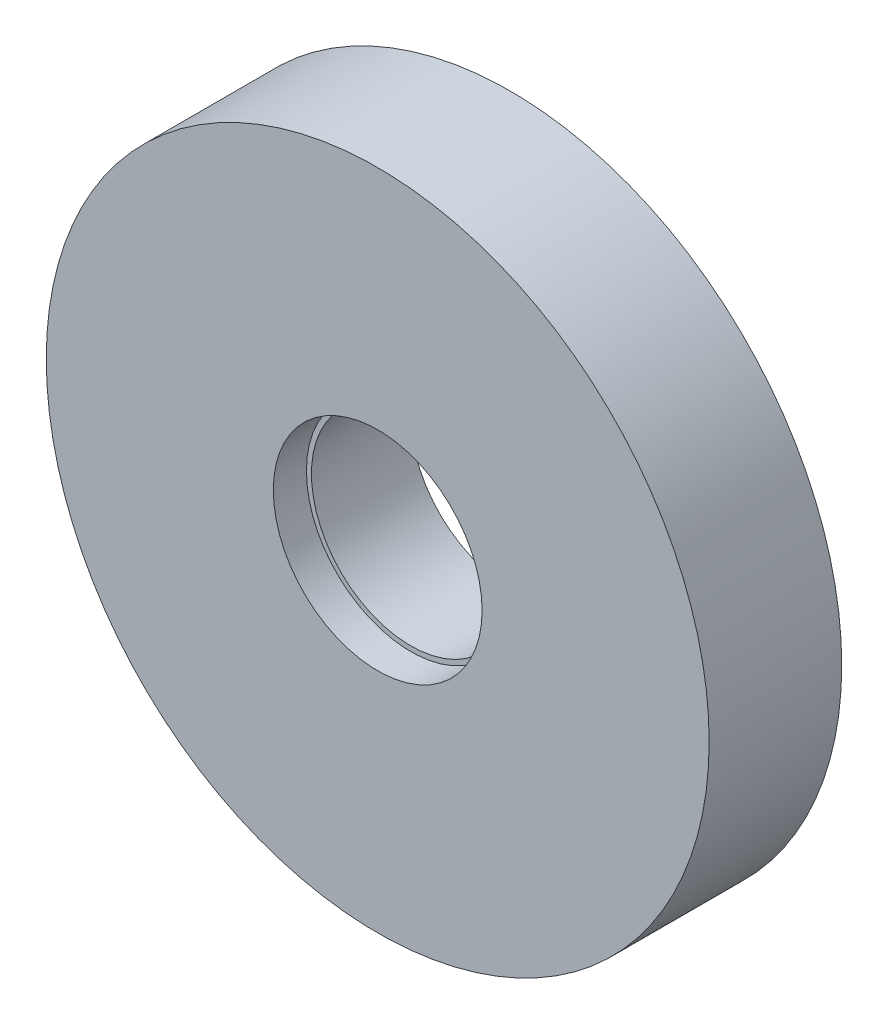
ISO-10303-21;
HEADER;
FILE_DESCRIPTION(('STEP AP214'),'2;1');
FILE_NAME('part.step','',(''),(''),'','','');
FILE_SCHEMA(('AUTOMOTIVE_DESIGN { 1 0 10303 214 1 1 1 1 }'));
ENDSEC;
DATA;
#1=APPLICATION_CONTEXT('core data for automotive mechanical design processes');
#2=APPLICATION_PROTOCOL_DEFINITION('international standard','automotive_design',2000,#1);
#3=PRODUCT_CONTEXT('',#1,'mechanical');
#4=PRODUCT('Part','Part','',(#3));
#5=PRODUCT_RELATED_PRODUCT_CATEGORY('part','',(#4));
#6=PRODUCT_DEFINITION_FORMATION('','',#4);
#7=PRODUCT_DEFINITION_CONTEXT('part definition',#1,'design');
#8=PRODUCT_DEFINITION('design','',#6,#7);
#9=PRODUCT_DEFINITION_SHAPE('','',#8);
#10=(LENGTH_UNIT() NAMED_UNIT(*) SI_UNIT(.MILLI.,.METRE.));
#11=(NAMED_UNIT(*) PLANE_ANGLE_UNIT() SI_UNIT($,.RADIAN.));
#12=(NAMED_UNIT(*) SI_UNIT($,.STERADIAN.) SOLID_ANGLE_UNIT());
#13=UNCERTAINTY_MEASURE_WITH_UNIT(LENGTH_MEASURE(1.E-05),#10,'distance_accuracy_value','');
#14=(GEOMETRIC_REPRESENTATION_CONTEXT(3) GLOBAL_UNCERTAINTY_ASSIGNED_CONTEXT((#13)) GLOBAL_UNIT_ASSIGNED_CONTEXT((#10,
#11,#12)) REPRESENTATION_CONTEXT('',''));
#15=CARTESIAN_POINT('',(0.,0.,0.));
#16=DIRECTION('',(0.,0.,1.));
#17=DIRECTION('',(1.,0.,0.));
#18=AXIS2_PLACEMENT_3D('',#15,#16,#17);
#19=CARTESIAN_POINT('',(0.,0.,0.));
#20=DIRECTION('',(0.,0.,1.));
#21=DIRECTION('',(1.,0.,0.));
#22=AXIS2_PLACEMENT_3D('',#19,#20,#21);
#23=PLANE('',#22);
#24=CARTESIAN_POINT('',(0.,0.,0.));
#25=DIRECTION('',(0.,0.,-1.));
#26=DIRECTION('',(-1.,0.,0.));
#27=AXIS2_PLACEMENT_3D('',#24,#25,#26);
#28=CIRCLE('',#27,3.);
#29=CARTESIAN_POINT('',(3.,0.,0.));
#30=VERTEX_POINT('',#29);
#31=EDGE_CURVE('E95',#30,#30,#28,.T.);
#32=ORIENTED_EDGE('',*,*,#31,.F.);
#33=EDGE_LOOP('',(#32));
#34=FACE_BOUND('',#33,.T.);
#35=CARTESIAN_POINT('',(0.,0.,0.));
#36=DIRECTION('',(0.,0.,1.));
#37=DIRECTION('',(1.,0.,0.));
#38=AXIS2_PLACEMENT_3D('',#35,#36,#37);
#39=CIRCLE('',#38,10.);
#40=CARTESIAN_POINT('',(10.,0.,0.));
#41=VERTEX_POINT('',#40);
#42=CARTESIAN_POINT('',(-10.,0.,0.));
#43=VERTEX_POINT('',#42);
#44=EDGE_CURVE('E10',#41,#43,#39,.T.);
#45=ORIENTED_EDGE('',*,*,#44,.F.);
#46=CARTESIAN_POINT('',(0.,0.,0.));
#47=DIRECTION('',(0.,0.,1.));
#48=DIRECTION('',(1.,0.,0.));
#49=AXIS2_PLACEMENT_3D('',#46,#47,#48);
#50=CIRCLE('',#49,10.);
#51=EDGE_CURVE('E25',#43,#41,#50,.T.);
#52=ORIENTED_EDGE('',*,*,#51,.F.);
#53=EDGE_LOOP('',(#45,#52));
#54=FACE_BOUND('',#53,.T.);
#55=ADVANCED_FACE('F15',(#34,#54),#23,.F.);
#56=CARTESIAN_POINT('',(0.,0.,4.));
#57=DIRECTION('',(0.,0.,1.));
#58=DIRECTION('',(1.,0.,0.));
#59=AXIS2_PLACEMENT_3D('',#56,#57,#58);
#60=PLANE('',#59);
#61=CARTESIAN_POINT('',(0.,0.,4.));
#62=DIRECTION('',(0.,0.,-1.));
#63=DIRECTION('',(1.,0.,0.));
#64=AXIS2_PLACEMENT_3D('',#61,#62,#63);
#65=CIRCLE('',#64,3.15);
#66=CARTESIAN_POINT('',(3.15,0.,4.));
#67=VERTEX_POINT('',#66);
#68=CARTESIAN_POINT('',(-3.15,0.,4.));
#69=VERTEX_POINT('',#68);
#70=EDGE_CURVE('E75',#67,#69,#65,.T.);
#71=ORIENTED_EDGE('',*,*,#70,.T.);
#72=CARTESIAN_POINT('',(0.,0.,4.));
#73=DIRECTION('',(0.,0.,-1.));
#74=DIRECTION('',(1.,0.,0.));
#75=AXIS2_PLACEMENT_3D('',#72,#73,#74);
#76=CIRCLE('',#75,3.15);
#77=EDGE_CURVE('E81',#69,#67,#76,.T.);
#78=ORIENTED_EDGE('',*,*,#77,.T.);
#79=EDGE_LOOP('',(#71,#78));
#80=FACE_BOUND('',#79,.T.);
#81=CARTESIAN_POINT('',(0.,0.,4.));
#82=DIRECTION('',(0.,0.,1.));
#83=DIRECTION('',(1.,0.,0.));
#84=AXIS2_PLACEMENT_3D('',#81,#82,#83);
#85=CIRCLE('',#84,10.);
#86=CARTESIAN_POINT('',(10.,0.,4.));
#87=VERTEX_POINT('',#86);
#88=CARTESIAN_POINT('',(-10.,0.,4.));
#89=VERTEX_POINT('',#88);
#90=EDGE_CURVE('E97',#87,#89,#85,.T.);
#91=ORIENTED_EDGE('',*,*,#90,.T.);
#92=CARTESIAN_POINT('',(0.,0.,4.));
#93=DIRECTION('',(0.,0.,1.));
#94=DIRECTION('',(1.,0.,0.));
#95=AXIS2_PLACEMENT_3D('',#92,#93,#94);
#96=CIRCLE('',#95,10.);
#97=EDGE_CURVE('E18',#89,#87,#96,.T.);
#98=ORIENTED_EDGE('',*,*,#97,.T.);
#99=EDGE_LOOP('',(#91,#98));
#100=FACE_BOUND('',#99,.T.);
#101=ADVANCED_FACE('F86',(#80,#100),#60,.T.);
#102=CARTESIAN_POINT('',(0.,0.,0.));
#103=DIRECTION('',(0.,0.,1.));
#104=DIRECTION('',(1.,0.,0.));
#105=AXIS2_PLACEMENT_3D('',#102,#103,#104);
#106=CYLINDRICAL_SURFACE('',#105,10.);
#107=ORIENTED_EDGE('',*,*,#90,.F.);
#108=ORIENTED_EDGE('',*,*,#97,.F.);
#109=DIRECTION('',(0.,0.,-1.));
#110=VECTOR('',#109,1.);
#111=CARTESIAN_POINT('',(-10.,0.,0.));
#112=LINE('',#111,#110);
#113=EDGE_CURVE('E101',#89,#43,#112,.T.);
#114=ORIENTED_EDGE('',*,*,#113,.T.);
#115=ORIENTED_EDGE('',*,*,#51,.T.);
#116=ORIENTED_EDGE('',*,*,#44,.T.);
#117=ORIENTED_EDGE('',*,*,#113,.F.);
#118=EDGE_LOOP('',(#107,#108,#114,#115,#116,#117));
#119=FACE_BOUND('',#118,.T.);
#120=ADVANCED_FACE('F133',(#119),#106,.T.);
#121=CARTESIAN_POINT('',(0.,0.,0.));
#122=DIRECTION('',(0.,0.,1.));
#123=DIRECTION('',(-1.,0.,0.));
#124=AXIS2_PLACEMENT_3D('',#121,#122,#123);
#125=CYLINDRICAL_SURFACE('',#124,3.);
#126=CARTESIAN_POINT('',(0.,0.,3.));
#127=DIRECTION('',(0.,0.,1.));
#128=DIRECTION('',(-1.,0.,0.));
#129=AXIS2_PLACEMENT_3D('',#126,#127,#128);
#130=CIRCLE('',#129,3.);
#131=CARTESIAN_POINT('',(3.,0.,3.));
#132=VERTEX_POINT('',#131);
#133=EDGE_CURVE('E104',#132,#132,#130,.T.);
#134=ORIENTED_EDGE('',*,*,#133,.T.);
#135=DIRECTION('',(0.,0.,-1.));
#136=VECTOR('',#135,1.);
#137=CARTESIAN_POINT('',(3.,0.,0.));
#138=LINE('',#137,#136);
#139=EDGE_CURVE('E98',#132,#30,#138,.T.);
#140=ORIENTED_EDGE('',*,*,#139,.T.);
#141=ORIENTED_EDGE('',*,*,#31,.T.);
#142=ORIENTED_EDGE('',*,*,#139,.F.);
#143=EDGE_LOOP('',(#134,#140,#141,#142));
#144=FACE_BOUND('',#143,.T.);
#145=ADVANCED_FACE('F142',(#144),#125,.F.);
#146=CARTESIAN_POINT('',(0.,0.,3.));
#147=DIRECTION('',(0.,0.,1.));
#148=DIRECTION('',(1.,0.,0.));
#149=AXIS2_PLACEMENT_3D('',#146,#147,#148);
#150=PLANE('',#149);
#151=ORIENTED_EDGE('',*,*,#133,.F.);
#152=EDGE_LOOP('',(#151));
#153=FACE_BOUND('',#152,.T.);
#154=CARTESIAN_POINT('',(0.,0.,3.));
#155=DIRECTION('',(0.,0.,-1.));
#156=DIRECTION('',(1.,0.,0.));
#157=AXIS2_PLACEMENT_3D('',#154,#155,#156);
#158=CIRCLE('',#157,3.15);
#159=CARTESIAN_POINT('',(3.15,0.,3.));
#160=VERTEX_POINT('',#159);
#161=CARTESIAN_POINT('',(-3.15,0.,3.));
#162=VERTEX_POINT('',#161);
#163=EDGE_CURVE('E77',#160,#162,#158,.T.);
#164=ORIENTED_EDGE('',*,*,#163,.F.);
#165=CARTESIAN_POINT('',(0.,0.,3.));
#166=DIRECTION('',(0.,0.,-1.));
#167=DIRECTION('',(1.,0.,0.));
#168=AXIS2_PLACEMENT_3D('',#165,#166,#167);
#169=CIRCLE('',#168,3.15);
#170=EDGE_CURVE('E80',#162,#160,#169,.T.);
#171=ORIENTED_EDGE('',*,*,#170,.F.);
#172=EDGE_LOOP('',(#164,#171));
#173=FACE_BOUND('',#172,.T.);
#174=ADVANCED_FACE('F185',(#153,#173),#150,.T.);
#175=CARTESIAN_POINT('',(0.,0.,4.));
#176=DIRECTION('',(0.,0.,-1.));
#177=DIRECTION('',(1.,0.,0.));
#178=AXIS2_PLACEMENT_3D('',#175,#176,#177);
#179=CYLINDRICAL_SURFACE('',#178,3.15);
#180=ORIENTED_EDGE('',*,*,#70,.F.);
#181=ORIENTED_EDGE('',*,*,#77,.F.);
#182=DIRECTION('',(0.,0.,-1.));
#183=VECTOR('',#182,1.);
#184=CARTESIAN_POINT('',(-3.15,0.,4.));
#185=LINE('',#184,#183);
#186=EDGE_CURVE('E71',#69,#162,#185,.T.);
#187=ORIENTED_EDGE('',*,*,#186,.T.);
#188=ORIENTED_EDGE('',*,*,#170,.T.);
#189=ORIENTED_EDGE('',*,*,#163,.T.);
#190=ORIENTED_EDGE('',*,*,#186,.F.);
#191=EDGE_LOOP('',(#180,#181,#187,#188,#189,#190));
#192=FACE_BOUND('',#191,.T.);
#193=ADVANCED_FACE('F73',(#192),#179,.F.);
#194=CLOSED_SHELL('',(#55,#101,#120,#145,#174,#193));
#195=MANIFOLD_SOLID_BREP('B1',#194);
#196=ADVANCED_BREP_SHAPE_REPRESENTATION('',(#18,#195),#14);
#197=SHAPE_DEFINITION_REPRESENTATION(#9,#196);
ENDSEC;
END-ISO-10303-21;
